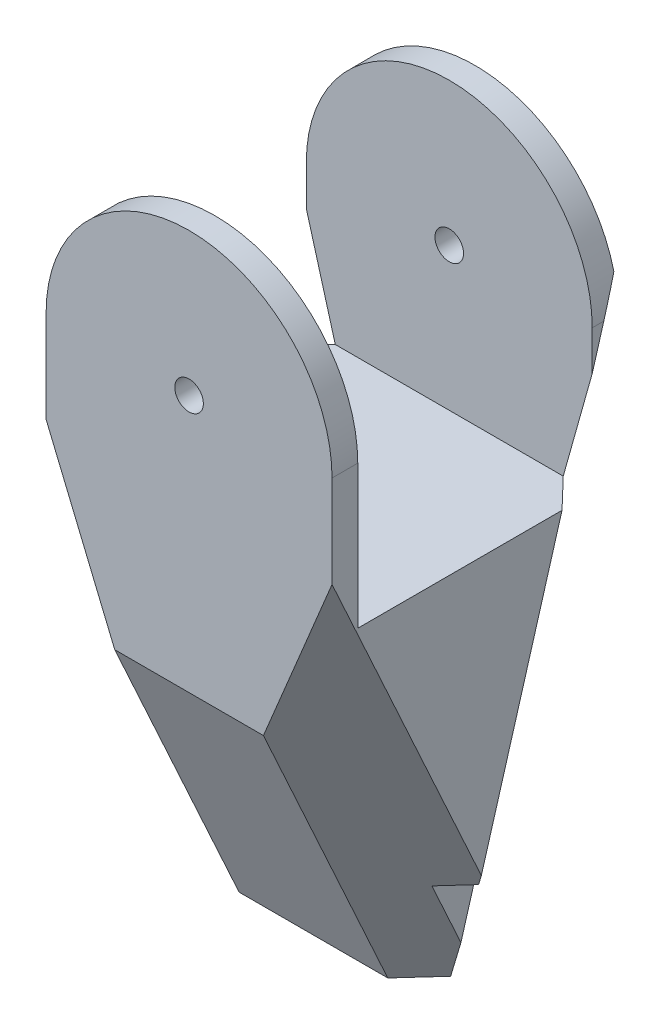
ISO-10303-21;
HEADER;
FILE_DESCRIPTION(('STEP AP214'),'2;1');
FILE_NAME('part.step','',(''),(''),'','','');
FILE_SCHEMA(('AUTOMOTIVE_DESIGN { 1 0 10303 214 1 1 1 1 }'));
ENDSEC;
DATA;
#1=APPLICATION_CONTEXT('core data for automotive mechanical design processes');
#2=APPLICATION_PROTOCOL_DEFINITION('international standard','automotive_design',2000,#1);
#3=PRODUCT_CONTEXT('',#1,'mechanical');
#4=PRODUCT('Part','Part','',(#3));
#5=PRODUCT_RELATED_PRODUCT_CATEGORY('part','',(#4));
#6=PRODUCT_DEFINITION_FORMATION('','',#4);
#7=PRODUCT_DEFINITION_CONTEXT('part definition',#1,'design');
#8=PRODUCT_DEFINITION('design','',#6,#7);
#9=PRODUCT_DEFINITION_SHAPE('','',#8);
#10=(LENGTH_UNIT() NAMED_UNIT(*) SI_UNIT(.MILLI.,.METRE.));
#11=(NAMED_UNIT(*) PLANE_ANGLE_UNIT() SI_UNIT($,.RADIAN.));
#12=(NAMED_UNIT(*) SI_UNIT($,.STERADIAN.) SOLID_ANGLE_UNIT());
#13=UNCERTAINTY_MEASURE_WITH_UNIT(LENGTH_MEASURE(1.E-05),#10,'distance_accuracy_value','');
#14=(GEOMETRIC_REPRESENTATION_CONTEXT(3) GLOBAL_UNCERTAINTY_ASSIGNED_CONTEXT((#13)) GLOBAL_UNIT_ASSIGNED_CONTEXT((#10,
#11,#12)) REPRESENTATION_CONTEXT('',''));
#15=CARTESIAN_POINT('',(0.,0.,0.));
#16=DIRECTION('',(0.,0.,1.));
#17=DIRECTION('',(1.,0.,0.));
#18=AXIS2_PLACEMENT_3D('',#15,#16,#17);
#19=CARTESIAN_POINT('',(-25.,100.,25.));
#20=DIRECTION('',(1.,0.,0.));
#21=DIRECTION('',(0.,0.,-1.));
#22=AXIS2_PLACEMENT_3D('',#19,#20,#21);
#23=PLANE('',#22);
#24=DIRECTION('',(0.,0.,-1.));
#25=VECTOR('',#24,1.);
#26=CARTESIAN_POINT('',(-25.,125.,-20.5));
#27=LINE('',#26,#25);
#28=CARTESIAN_POINT('',(-25.,125.,-20.5));
#29=VERTEX_POINT('',#28);
#30=CARTESIAN_POINT('',(-25.,125.,-22.5269685393409));
#31=VERTEX_POINT('',#30);
#32=EDGE_CURVE('E297',#29,#31,#27,.T.);
#33=ORIENTED_EDGE('',*,*,#32,.T.);
#34=DIRECTION('',(0.,-0.959829265823924,0.280584711750137));
#35=VECTOR('',#34,1.);
#36=CARTESIAN_POINT('',(-25.,89.1685441728664,-12.0524403468568));
#37=LINE('',#36,#35);
#38=CARTESIAN_POINT('',(-25.,118.066109294307,-20.5));
#39=VERTEX_POINT('',#38);
#40=EDGE_CURVE('E416',#31,#39,#37,.T.);
#41=ORIENTED_EDGE('',*,*,#40,.T.);
#42=DIRECTION('',(0.,1.,0.));
#43=VECTOR('',#42,1.);
#44=CARTESIAN_POINT('',(-25.,100.,-20.5));
#45=LINE('',#44,#43);
#46=EDGE_CURVE('E290',#39,#29,#45,.T.);
#47=ORIENTED_EDGE('',*,*,#46,.T.);
#48=EDGE_LOOP('',(#33,#41,#47));
#49=FACE_BOUND('',#48,.T.);
#50=ADVANCED_FACE('F88',(#49),#23,.F.);
#51=CARTESIAN_POINT('',(25.,100.,25.));
#52=DIRECTION('',(-1.,0.,0.));
#53=DIRECTION('',(0.,0.,1.));
#54=AXIS2_PLACEMENT_3D('',#51,#52,#53);
#55=PLANE('',#54);
#56=DIRECTION('',(0.,-0.909538676075035,-0.415619293011853));
#57=VECTOR('',#56,1.);
#58=CARTESIAN_POINT('',(25.,101.532643581669,21.6459723174444));
#59=LINE('',#58,#57);
#60=CARTESIAN_POINT('',(25.,108.872576903348,25.));
#61=VERTEX_POINT('',#60);
#62=CARTESIAN_POINT('',(25.,51.7347196548867,-1.10949535021056));
#63=VERTEX_POINT('',#62);
#64=EDGE_CURVE('E320',#61,#63,#59,.T.);
#65=ORIENTED_EDGE('',*,*,#64,.T.);
#66=DIRECTION('',(0.,0.959829265823924,-0.280584711750137));
#67=VECTOR('',#66,1.);
#68=CARTESIAN_POINT('',(25.,89.1685441728664,-12.0524403468568));
#69=LINE('',#68,#67);
#70=CARTESIAN_POINT('',(25.,100.,-15.2187752558906));
#71=VERTEX_POINT('',#70);
#72=EDGE_CURVE('E362',#63,#71,#69,.T.);
#73=ORIENTED_EDGE('',*,*,#72,.T.);
#74=DIRECTION('',(0.,0.,-1.));
#75=VECTOR('',#74,1.);
#76=CARTESIAN_POINT('',(25.,100.,25.));
#77=LINE('',#76,#75);
#78=CARTESIAN_POINT('',(25.,100.,20.5));
#79=VERTEX_POINT('',#78);
#80=EDGE_CURVE('E257',#79,#71,#77,.T.);
#81=ORIENTED_EDGE('',*,*,#80,.F.);
#82=DIRECTION('',(0.,-1.,0.));
#83=VECTOR('',#82,1.);
#84=CARTESIAN_POINT('',(25.,100.,20.5));
#85=LINE('',#84,#83);
#86=CARTESIAN_POINT('',(25.,125.,20.5));
#87=VERTEX_POINT('',#86);
#88=EDGE_CURVE('E232',#87,#79,#85,.T.);
#89=ORIENTED_EDGE('',*,*,#88,.F.);
#90=DIRECTION('',(0.,0.,1.));
#91=VECTOR('',#90,1.);
#92=CARTESIAN_POINT('',(25.,125.,20.5));
#93=LINE('',#92,#91);
#94=CARTESIAN_POINT('',(25.,125.,25.));
#95=VERTEX_POINT('',#94);
#96=EDGE_CURVE('E242',#87,#95,#93,.T.);
#97=ORIENTED_EDGE('',*,*,#96,.T.);
#98=DIRECTION('',(0.,-1.,0.));
#99=VECTOR('',#98,1.);
#100=CARTESIAN_POINT('',(25.,100.,25.));
#101=LINE('',#100,#99);
#102=EDGE_CURVE('E313',#95,#61,#101,.T.);
#103=ORIENTED_EDGE('',*,*,#102,.T.);
#104=EDGE_LOOP('',(#65,#73,#81,#89,#97,#103));
#105=FACE_BOUND('',#104,.T.);
#106=ADVANCED_FACE('F254',(#105),#55,.F.);
#107=DIRECTION('',(0.,0.,1.));
#108=VECTOR('',#107,1.);
#109=CARTESIAN_POINT('',(-25.,100.,25.));
#110=LINE('',#109,#108);
#111=CARTESIAN_POINT('',(-25.,100.,-15.2187752558907));
#112=VERTEX_POINT('',#111);
#113=CARTESIAN_POINT('',(-25.,100.,20.5));
#114=VERTEX_POINT('',#113);
#115=EDGE_CURVE('E310',#112,#114,#110,.T.);
#116=ORIENTED_EDGE('',*,*,#115,.F.);
#117=DIRECTION('',(0.,-0.959829265823924,0.280584711750137));
#118=VECTOR('',#117,1.);
#119=CARTESIAN_POINT('',(-25.,89.1685441728664,-12.0524403468568));
#120=LINE('',#119,#118);
#121=CARTESIAN_POINT('',(-25.,51.7347196548867,-1.10949535021057));
#122=VERTEX_POINT('',#121);
#123=EDGE_CURVE('E413',#112,#122,#120,.T.);
#124=ORIENTED_EDGE('',*,*,#123,.T.);
#125=DIRECTION('',(0.,0.909538676075035,0.415619293011853));
#126=VECTOR('',#125,1.);
#127=CARTESIAN_POINT('',(-25.,101.532643581669,21.6459723174444));
#128=LINE('',#127,#126);
#129=CARTESIAN_POINT('',(-25.,108.872576903348,25.));
#130=VERTEX_POINT('',#129);
#131=EDGE_CURVE('E350',#122,#130,#128,.T.);
#132=ORIENTED_EDGE('',*,*,#131,.T.);
#133=DIRECTION('',(0.,-1.,0.));
#134=VECTOR('',#133,1.);
#135=CARTESIAN_POINT('',(-25.,100.,25.));
#136=LINE('',#135,#134);
#137=CARTESIAN_POINT('',(-25.,125.,25.));
#138=VERTEX_POINT('',#137);
#139=EDGE_CURVE('E316',#138,#130,#136,.T.);
#140=ORIENTED_EDGE('',*,*,#139,.F.);
#141=DIRECTION('',(0.,0.,1.));
#142=VECTOR('',#141,1.);
#143=CARTESIAN_POINT('',(-25.,125.,20.5));
#144=LINE('',#143,#142);
#145=CARTESIAN_POINT('',(-25.,125.,20.5));
#146=VERTEX_POINT('',#145);
#147=EDGE_CURVE('E249',#146,#138,#144,.T.);
#148=ORIENTED_EDGE('',*,*,#147,.F.);
#149=DIRECTION('',(0.,1.,0.));
#150=VECTOR('',#149,1.);
#151=CARTESIAN_POINT('',(-25.,100.,20.5));
#152=LINE('',#151,#150);
#153=EDGE_CURVE('E234',#114,#146,#152,.T.);
#154=ORIENTED_EDGE('',*,*,#153,.F.);
#155=EDGE_LOOP('',(#116,#124,#132,#140,#148,#154));
#156=FACE_BOUND('',#155,.T.);
#157=ADVANCED_FACE('F499',(#156),#23,.F.);
#158=CARTESIAN_POINT('',(-25.,100.,25.));
#159=DIRECTION('',(0.,0.,-1.));
#160=DIRECTION('',(-1.,0.,0.));
#161=AXIS2_PLACEMENT_3D('',#158,#159,#160);
#162=PLANE('',#161);
#163=CARTESIAN_POINT('',(0.,125.,25.));
#164=DIRECTION('',(0.,0.,-1.));
#165=DIRECTION('',(-1.,0.,0.));
#166=AXIS2_PLACEMENT_3D('',#163,#164,#165);
#167=CIRCLE('',#166,2.5);
#168=CARTESIAN_POINT('',(-2.5,125.,25.));
#169=VERTEX_POINT('',#168);
#170=EDGE_CURVE('E264',#169,#169,#167,.T.);
#171=ORIENTED_EDGE('',*,*,#170,.T.);
#172=EDGE_LOOP('',(#171));
#173=FACE_BOUND('',#172,.T.);
#174=DIRECTION('',(1.,0.,0.));
#175=VECTOR('',#174,1.);
#176=CARTESIAN_POINT('',(-25.,80.,25.));
#177=LINE('',#176,#175);
#178=CARTESIAN_POINT('',(-13.,80.,25.));
#179=VERTEX_POINT('',#178);
#180=CARTESIAN_POINT('',(13.,80.,25.));
#181=VERTEX_POINT('',#180);
#182=EDGE_CURVE('E453',#179,#181,#177,.T.);
#183=ORIENTED_EDGE('',*,*,#182,.T.);
#184=DIRECTION('',(-0.383791137484564,-0.923419927653884,0.));
#185=VECTOR('',#184,1.);
#186=CARTESIAN_POINT('',(22.3987248092515,102.613783737377,25.));
#187=LINE('',#186,#185);
#188=EDGE_CURVE('E347',#181,#61,#187,.F.);
#189=ORIENTED_EDGE('',*,*,#188,.T.);
#190=ORIENTED_EDGE('',*,*,#102,.F.);
#191=CARTESIAN_POINT('',(0.,125.,25.));
#192=DIRECTION('',(0.,0.,-1.));
#193=DIRECTION('',(1.,0.,0.));
#194=AXIS2_PLACEMENT_3D('',#191,#192,#193);
#195=CIRCLE('',#194,25.);
#196=EDGE_CURVE('E245',#138,#95,#195,.T.);
#197=ORIENTED_EDGE('',*,*,#196,.F.);
#198=ORIENTED_EDGE('',*,*,#139,.T.);
#199=DIRECTION('',(-0.383791137484564,0.923419927653884,0.));
#200=VECTOR('',#199,1.);
#201=CARTESIAN_POINT('',(-22.3987248092515,102.613783737377,25.));
#202=LINE('',#201,#200);
#203=EDGE_CURVE('E344',#130,#179,#202,.F.);
#204=ORIENTED_EDGE('',*,*,#203,.T.);
#205=EDGE_LOOP('',(#183,#189,#190,#197,#198,#204));
#206=FACE_BOUND('',#205,.T.);
#207=ADVANCED_FACE('F478',(#173,#206),#162,.F.);
#208=CARTESIAN_POINT('',(-25.,100.,-25.));
#209=DIRECTION('',(0.,0.,1.));
#210=DIRECTION('',(1.,0.,0.));
#211=AXIS2_PLACEMENT_3D('',#208,#209,#210);
#212=PLANE('',#211);
#213=CARTESIAN_POINT('',(0.,125.,-25.));
#214=DIRECTION('',(0.,0.,-1.));
#215=DIRECTION('',(-1.,0.,0.));
#216=AXIS2_PLACEMENT_3D('',#213,#214,#215);
#217=CIRCLE('',#216,2.5);
#218=CARTESIAN_POINT('',(-2.5,125.,-25.));
#219=VERTEX_POINT('',#218);
#220=EDGE_CURVE('E272',#219,#219,#217,.T.);
#221=ORIENTED_EDGE('',*,*,#220,.F.);
#222=EDGE_LOOP('',(#221));
#223=FACE_BOUND('',#222,.T.);
#224=CARTESIAN_POINT('',(0.,125.,-25.));
#225=DIRECTION('',(0.,0.,-1.));
#226=DIRECTION('',(1.,0.,0.));
#227=AXIS2_PLACEMENT_3D('',#224,#225,#226);
#228=CIRCLE('',#227,25.);
#229=CARTESIAN_POINT('',(-24.2882226521992,130.923026287059,-25.));
#230=VERTEX_POINT('',#229);
#231=CARTESIAN_POINT('',(24.2882226521992,130.92302628706,-25.));
#232=VERTEX_POINT('',#231);
#233=EDGE_CURVE('E278',#230,#232,#228,.T.);
#234=ORIENTED_EDGE('',*,*,#233,.T.);
#235=DIRECTION('',(0.270151928578531,0.962817706258719,0.));
#236=VECTOR('',#235,1.);
#237=CARTESIAN_POINT('',(13.4795340389793,92.4010107937666,-25.));
#238=LINE('',#237,#236);
#239=CARTESIAN_POINT('',(9.99999999999994,80.,-25.));
#240=VERTEX_POINT('',#239);
#241=EDGE_CURVE('E386',#232,#240,#238,.F.);
#242=ORIENTED_EDGE('',*,*,#241,.T.);
#243=DIRECTION('',(1.,0.,0.));
#244=VECTOR('',#243,1.);
#245=CARTESIAN_POINT('',(-25.,80.,-25.));
#246=LINE('',#245,#244);
#247=CARTESIAN_POINT('',(-9.99999999999996,80.,-25.));
#248=VERTEX_POINT('',#247);
#249=EDGE_CURVE('E460',#248,#240,#246,.T.);
#250=ORIENTED_EDGE('',*,*,#249,.F.);
#251=DIRECTION('',(0.270151928578531,-0.962817706258719,0.));
#252=VECTOR('',#251,1.);
#253=CARTESIAN_POINT('',(-13.4795340389793,92.4010107937666,-25.));
#254=LINE('',#253,#252);
#255=EDGE_CURVE('E383',#248,#230,#254,.F.);
#256=ORIENTED_EDGE('',*,*,#255,.T.);
#257=EDGE_LOOP('',(#234,#242,#250,#256));
#258=FACE_BOUND('',#257,.T.);
#259=ADVANCED_FACE('F514',(#223,#258),#212,.F.);
#260=DIRECTION('',(0.,-1.,0.));
#261=VECTOR('',#260,1.);
#262=CARTESIAN_POINT('',(25.,100.,-20.5));
#263=LINE('',#262,#261);
#264=CARTESIAN_POINT('',(25.,125.,-20.5));
#265=VERTEX_POINT('',#264);
#266=CARTESIAN_POINT('',(25.,118.066109294307,-20.5));
#267=VERTEX_POINT('',#266);
#268=EDGE_CURVE('E282',#265,#267,#263,.T.);
#269=ORIENTED_EDGE('',*,*,#268,.T.);
#270=DIRECTION('',(0.,0.959829265823924,-0.280584711750137));
#271=VECTOR('',#270,1.);
#272=CARTESIAN_POINT('',(25.,89.1685441728664,-12.0524403468568));
#273=LINE('',#272,#271);
#274=CARTESIAN_POINT('',(25.,125.,-22.5269685393409));
#275=VERTEX_POINT('',#274);
#276=EDGE_CURVE('E359',#267,#275,#273,.T.);
#277=ORIENTED_EDGE('',*,*,#276,.T.);
#278=DIRECTION('',(0.,0.,-1.));
#279=VECTOR('',#278,1.);
#280=CARTESIAN_POINT('',(25.,125.,-20.5));
#281=LINE('',#280,#279);
#282=EDGE_CURVE('E301',#265,#275,#281,.T.);
#283=ORIENTED_EDGE('',*,*,#282,.F.);
#284=EDGE_LOOP('',(#269,#277,#283));
#285=FACE_BOUND('',#284,.T.);
#286=ADVANCED_FACE('F505',(#285),#55,.F.);
#287=CARTESIAN_POINT('',(0.,100.,0.));
#288=DIRECTION('',(0.,-1.,0.));
#289=DIRECTION('',(0.,0.,-1.));
#290=AXIS2_PLACEMENT_3D('',#287,#288,#289);
#291=PLANE('',#290);
#292=ORIENTED_EDGE('',*,*,#80,.T.);
#293=DIRECTION('',(0.69246772471892,0.,0.721448854890353));
#294=VECTOR('',#293,1.);
#295=CARTESIAN_POINT('',(26.5818377428217,100.,-13.5707345062019));
#296=LINE('',#295,#294);
#297=CARTESIAN_POINT('',(19.9309259312104,100.,-20.5));
#298=VERTEX_POINT('',#297);
#299=EDGE_CURVE('E368',#71,#298,#296,.F.);
#300=ORIENTED_EDGE('',*,*,#299,.T.);
#301=DIRECTION('',(-1.,0.,0.));
#302=VECTOR('',#301,1.);
#303=CARTESIAN_POINT('',(25.,100.,-20.5));
#304=LINE('',#303,#302);
#305=CARTESIAN_POINT('',(-19.9309259312104,100.,-20.5));
#306=VERTEX_POINT('',#305);
#307=EDGE_CURVE('E286',#298,#306,#304,.T.);
#308=ORIENTED_EDGE('',*,*,#307,.T.);
#309=DIRECTION('',(0.69246772471892,0.,-0.721448854890353));
#310=VECTOR('',#309,1.);
#311=CARTESIAN_POINT('',(-26.5818377428217,100.,-13.5707345062019));
#312=LINE('',#311,#310);
#313=EDGE_CURVE('E365',#306,#112,#312,.F.);
#314=ORIENTED_EDGE('',*,*,#313,.T.);
#315=ORIENTED_EDGE('',*,*,#115,.T.);
#316=DIRECTION('',(-1.,0.,0.));
#317=VECTOR('',#316,1.);
#318=CARTESIAN_POINT('',(25.,100.,20.5));
#319=LINE('',#318,#317);
#320=EDGE_CURVE('E250',#79,#114,#319,.T.);
#321=ORIENTED_EDGE('',*,*,#320,.F.);
#322=EDGE_LOOP('',(#292,#300,#308,#314,#315,#321));
#323=FACE_BOUND('',#322,.T.);
#324=ADVANCED_FACE('F519',(#323),#291,.F.);
#325=CARTESIAN_POINT('',(0.,125.,-20.5));
#326=DIRECTION('',(0.,0.,-1.));
#327=DIRECTION('',(-1.,0.,0.));
#328=AXIS2_PLACEMENT_3D('',#325,#326,#327);
#329=CYLINDRICAL_SURFACE('',#328,25.);
#330=ORIENTED_EDGE('',*,*,#282,.T.);
#331=CARTESIAN_POINT('',(0.,125.,-48.5732674907901));
#332=DIRECTION('',(-0.707106781186547,0.198403352375795,0.678701782645403));
#333=DIRECTION('',(-0.65346609360035,0.183352595511343,-0.734413977422783));
#334=AXIS2_PLACEMENT_3D('',#331,#332,#333);
#335=ELLIPSE('',#334,36.8350292267636,25.);
#336=EDGE_CURVE('E380',#275,#232,#335,.T.);
#337=ORIENTED_EDGE('',*,*,#336,.T.);
#338=ORIENTED_EDGE('',*,*,#233,.F.);
#339=CARTESIAN_POINT('',(0.,125.,-48.5732674907902));
#340=DIRECTION('',(0.707106781186547,0.198403352375795,0.678701782645402));
#341=DIRECTION('',(0.65346609360035,0.183352595511342,-0.734413977422783));
#342=AXIS2_PLACEMENT_3D('',#339,#340,#341);
#343=ELLIPSE('',#342,36.8350292267637,25.);
#344=EDGE_CURVE('E377',#230,#31,#343,.T.);
#345=ORIENTED_EDGE('',*,*,#344,.T.);
#346=ORIENTED_EDGE('',*,*,#32,.F.);
#347=CARTESIAN_POINT('',(0.,125.,-20.5));
#348=DIRECTION('',(0.,0.,-1.));
#349=DIRECTION('',(1.,0.,0.));
#350=AXIS2_PLACEMENT_3D('',#347,#348,#349);
#351=CIRCLE('',#350,25.);
#352=EDGE_CURVE('E293',#29,#265,#351,.T.);
#353=ORIENTED_EDGE('',*,*,#352,.T.);
#354=EDGE_LOOP('',(#330,#337,#338,#345,#346,#353));
#355=FACE_BOUND('',#354,.T.);
#356=ADVANCED_FACE('F535',(#355),#329,.T.);
#357=CARTESIAN_POINT('',(0.,125.,-20.5));
#358=DIRECTION('',(0.,0.,1.));
#359=DIRECTION('',(1.,0.,0.));
#360=AXIS2_PLACEMENT_3D('',#357,#358,#359);
#361=PLANE('',#360);
#362=CARTESIAN_POINT('',(0.,125.,-20.5));
#363=DIRECTION('',(0.,0.,-1.));
#364=DIRECTION('',(-1.,0.,0.));
#365=AXIS2_PLACEMENT_3D('',#362,#363,#364);
#366=CIRCLE('',#365,2.5);
#367=CARTESIAN_POINT('',(-2.5,125.,-20.5));
#368=VERTEX_POINT('',#367);
#369=EDGE_CURVE('E274',#368,#368,#366,.T.);
#370=ORIENTED_EDGE('',*,*,#369,.T.);
#371=EDGE_LOOP('',(#370));
#372=FACE_BOUND('',#371,.T.);
#373=ORIENTED_EDGE('',*,*,#307,.F.);
#374=DIRECTION('',(-0.270151928578531,-0.962817706258719,0.));
#375=VECTOR('',#374,1.);
#376=CARTESIAN_POINT('',(24.9790023144448,117.991273835795,-20.5));
#377=LINE('',#376,#375);
#378=EDGE_CURVE('E374',#298,#267,#377,.F.);
#379=ORIENTED_EDGE('',*,*,#378,.T.);
#380=ORIENTED_EDGE('',*,*,#268,.F.);
#381=ORIENTED_EDGE('',*,*,#352,.F.);
#382=ORIENTED_EDGE('',*,*,#46,.F.);
#383=DIRECTION('',(-0.270151928578531,0.962817706258719,0.));
#384=VECTOR('',#383,1.);
#385=CARTESIAN_POINT('',(-24.9790023144448,117.991273835795,-20.5));
#386=LINE('',#385,#384);
#387=EDGE_CURVE('E371',#39,#306,#386,.F.);
#388=ORIENTED_EDGE('',*,*,#387,.T.);
#389=EDGE_LOOP('',(#373,#379,#380,#381,#382,#388));
#390=FACE_BOUND('',#389,.T.);
#391=ADVANCED_FACE('F523',(#372,#390),#361,.T.);
#392=CARTESIAN_POINT('',(0.,125.,-20.5));
#393=DIRECTION('',(0.,0.,-1.));
#394=DIRECTION('',(-1.,0.,0.));
#395=AXIS2_PLACEMENT_3D('',#392,#393,#394);
#396=CYLINDRICAL_SURFACE('',#395,2.5);
#397=ORIENTED_EDGE('',*,*,#369,.F.);
#398=EDGE_LOOP('',(#397));
#399=FACE_BOUND('',#398,.T.);
#400=ORIENTED_EDGE('',*,*,#220,.T.);
#401=EDGE_LOOP('',(#400));
#402=FACE_BOUND('',#401,.T.);
#403=ADVANCED_FACE('F662',(#399,#402),#396,.F.);
#404=CARTESIAN_POINT('',(0.,125.,20.5));
#405=DIRECTION('',(0.,0.,-1.));
#406=DIRECTION('',(1.,0.,0.));
#407=AXIS2_PLACEMENT_3D('',#404,#405,#406);
#408=PLANE('',#407);
#409=ORIENTED_EDGE('',*,*,#88,.T.);
#410=ORIENTED_EDGE('',*,*,#320,.T.);
#411=ORIENTED_EDGE('',*,*,#153,.T.);
#412=CARTESIAN_POINT('',(0.,125.,20.5));
#413=DIRECTION('',(0.,0.,-1.));
#414=DIRECTION('',(1.,0.,0.));
#415=AXIS2_PLACEMENT_3D('',#412,#413,#414);
#416=CIRCLE('',#415,25.);
#417=EDGE_CURVE('E226',#146,#87,#416,.T.);
#418=ORIENTED_EDGE('',*,*,#417,.T.);
#419=EDGE_LOOP('',(#409,#410,#411,#418));
#420=FACE_BOUND('',#419,.T.);
#421=CARTESIAN_POINT('',(0.,125.,20.5));
#422=DIRECTION('',(0.,0.,-1.));
#423=DIRECTION('',(-1.,0.,0.));
#424=AXIS2_PLACEMENT_3D('',#421,#422,#423);
#425=CIRCLE('',#424,2.5);
#426=CARTESIAN_POINT('',(-2.5,125.,20.5));
#427=VERTEX_POINT('',#426);
#428=EDGE_CURVE('E261',#427,#427,#425,.T.);
#429=ORIENTED_EDGE('',*,*,#428,.F.);
#430=EDGE_LOOP('',(#429));
#431=FACE_BOUND('',#430,.T.);
#432=ADVANCED_FACE('F228',(#420,#431),#408,.T.);
#433=CARTESIAN_POINT('',(0.,125.,20.5));
#434=DIRECTION('',(0.,0.,1.));
#435=DIRECTION('',(1.,0.,0.));
#436=AXIS2_PLACEMENT_3D('',#433,#434,#435);
#437=CYLINDRICAL_SURFACE('',#436,25.);
#438=ORIENTED_EDGE('',*,*,#196,.T.);
#439=ORIENTED_EDGE('',*,*,#96,.F.);
#440=ORIENTED_EDGE('',*,*,#417,.F.);
#441=ORIENTED_EDGE('',*,*,#147,.T.);
#442=EDGE_LOOP('',(#438,#439,#440,#441));
#443=FACE_BOUND('',#442,.T.);
#444=ADVANCED_FACE('F243',(#443),#437,.T.);
#445=CARTESIAN_POINT('',(0.,125.,20.5));
#446=DIRECTION('',(0.,0.,1.));
#447=DIRECTION('',(1.,0.,0.));
#448=AXIS2_PLACEMENT_3D('',#445,#446,#447);
#449=CYLINDRICAL_SURFACE('',#448,2.5);
#450=ORIENTED_EDGE('',*,*,#428,.T.);
#451=EDGE_LOOP('',(#450));
#452=FACE_BOUND('',#451,.T.);
#453=ORIENTED_EDGE('',*,*,#170,.F.);
#454=EDGE_LOOP('',(#453));
#455=FACE_BOUND('',#454,.T.);
#456=ADVANCED_FACE('F481',(#452,#455),#449,.F.);
#457=CARTESIAN_POINT('',(20.5,0.,0.));
#458=DIRECTION('',(-1.,0.,0.));
#459=DIRECTION('',(0.,0.,1.));
#460=AXIS2_PLACEMENT_3D('',#457,#458,#459);
#461=PLANE('',#460);
#462=DIRECTION('',(0.,0.909538676075035,0.415619293011852));
#463=VECTOR('',#462,1.);
#464=CARTESIAN_POINT('',(20.5,99.6623567631155,25.7388963597821));
#465=LINE('',#464,#463);
#466=CARTESIAN_POINT('',(20.5,50.,3.04537694149886));
#467=VERTEX_POINT('',#466);
#468=CARTESIAN_POINT('',(20.5,38.8745779359882,-2.03845310810049));
#469=VERTEX_POINT('',#468);
#470=EDGE_CURVE('E327',#467,#469,#465,.F.);
#471=ORIENTED_EDGE('',*,*,#470,.T.);
#472=DIRECTION('',(0.,-0.959829265823924,0.280584711750137));
#473=VECTOR('',#472,1.);
#474=CARTESIAN_POINT('',(20.5,87.9059129699908,-16.3716720430644));
#475=LINE('',#474,#473);
#476=CARTESIAN_POINT('',(20.5,50.,-5.29072250025093));
#477=VERTEX_POINT('',#476);
#478=EDGE_CURVE('E407',#469,#477,#475,.F.);
#479=ORIENTED_EDGE('',*,*,#478,.T.);
#480=DIRECTION('',(0.,0.,1.));
#481=VECTOR('',#480,1.);
#482=CARTESIAN_POINT('',(20.5,50.,25.));
#483=LINE('',#482,#481);
#484=EDGE_CURVE('E468',#477,#467,#483,.T.);
#485=ORIENTED_EDGE('',*,*,#484,.T.);
#486=EDGE_LOOP('',(#471,#479,#485));
#487=FACE_BOUND('',#486,.T.);
#488=ADVANCED_FACE('F483',(#487),#461,.F.);
#489=CARTESIAN_POINT('',(20.5,50.,25.));
#490=DIRECTION('',(0.,1.,0.));
#491=DIRECTION('',(0.,0.,1.));
#492=AXIS2_PLACEMENT_3D('',#489,#490,#491);
#493=PLANE('',#492);
#494=ORIENTED_EDGE('',*,*,#484,.F.);
#495=DIRECTION('',(-0.69246772471892,0.,-0.721448854890353));
#496=VECTOR('',#495,1.);
#497=CARTESIAN_POINT('',(19.2797826540724,50.,-6.56200833136185));
#498=LINE('',#497,#496);
#499=CARTESIAN_POINT('',(24.392989702787,50.,-1.23480355570279));
#500=VERTEX_POINT('',#499);
#501=EDGE_CURVE('E410',#477,#500,#498,.F.);
#502=ORIENTED_EDGE('',*,*,#501,.T.);
#503=DIRECTION('',(0.672854135215655,0.,-0.739775177147215));
#504=VECTOR('',#503,1.);
#505=CARTESIAN_POINT('',(13.2786500983812,50.,10.9849512461138));
#506=LINE('',#505,#504);
#507=EDGE_CURVE('E323',#500,#467,#506,.F.);
#508=ORIENTED_EDGE('',*,*,#507,.T.);
#509=EDGE_LOOP('',(#494,#502,#508));
#510=FACE_BOUND('',#509,.T.);
#511=ADVANCED_FACE('F490',(#510),#493,.F.);
#512=CARTESIAN_POINT('',(-20.5,0.,0.));
#513=DIRECTION('',(1.,0.,0.));
#514=DIRECTION('',(0.,0.,1.));
#515=AXIS2_PLACEMENT_3D('',#512,#513,#514);
#516=PLANE('',#515);
#517=DIRECTION('',(0.,0.,1.));
#518=VECTOR('',#517,1.);
#519=CARTESIAN_POINT('',(-20.5,50.,25.));
#520=LINE('',#519,#518);
#521=CARTESIAN_POINT('',(-20.5,50.,-5.29072250025096));
#522=VERTEX_POINT('',#521);
#523=CARTESIAN_POINT('',(-20.5,50.,3.04537694149886));
#524=VERTEX_POINT('',#523);
#525=EDGE_CURVE('E435',#522,#524,#520,.T.);
#526=ORIENTED_EDGE('',*,*,#525,.F.);
#527=DIRECTION('',(0.,0.959829265823924,-0.280584711750137));
#528=VECTOR('',#527,1.);
#529=CARTESIAN_POINT('',(-20.5,87.9059129699907,-16.3716720430644));
#530=LINE('',#529,#528);
#531=CARTESIAN_POINT('',(-20.5,38.8745779359881,-2.0384531081005));
#532=VERTEX_POINT('',#531);
#533=EDGE_CURVE('E12',#522,#532,#530,.F.);
#534=ORIENTED_EDGE('',*,*,#533,.T.);
#535=DIRECTION('',(0.,-0.909538676075035,-0.415619293011852));
#536=VECTOR('',#535,1.);
#537=CARTESIAN_POINT('',(-20.5,99.6623567631155,25.7388963597821));
#538=LINE('',#537,#536);
#539=EDGE_CURVE('E353',#532,#524,#538,.F.);
#540=ORIENTED_EDGE('',*,*,#539,.T.);
#541=EDGE_LOOP('',(#526,#534,#540));
#542=FACE_BOUND('',#541,.T.);
#543=ADVANCED_FACE('F567',(#542),#516,.F.);
#544=CARTESIAN_POINT('',(-20.5,50.,25.));
#545=DIRECTION('',(0.,-1.,0.));
#546=DIRECTION('',(0.,0.,-1.));
#547=AXIS2_PLACEMENT_3D('',#544,#545,#546);
#548=PLANE('',#547);
#549=DIRECTION('',(0.672854135215655,0.,0.739775177147215));
#550=VECTOR('',#549,1.);
#551=CARTESIAN_POINT('',(-9.57184954650072,50.,15.0604245045754));
#552=LINE('',#551,#550);
#553=CARTESIAN_POINT('',(-24.392989702787,50.,-1.2348035557028));
#554=VERTEX_POINT('',#553);
#555=EDGE_CURVE('E356',#524,#554,#552,.F.);
#556=ORIENTED_EDGE('',*,*,#555,.T.);
#557=DIRECTION('',(-0.69246772471892,0.,0.721448854890353));
#558=VECTOR('',#557,1.);
#559=CARTESIAN_POINT('',(-35.6326405717628,50.,10.4752487100276));
#560=LINE('',#559,#558);
#561=EDGE_CURVE('E98',#554,#522,#560,.F.);
#562=ORIENTED_EDGE('',*,*,#561,.T.);
#563=ORIENTED_EDGE('',*,*,#525,.T.);
#564=EDGE_LOOP('',(#556,#562,#563));
#565=FACE_BOUND('',#564,.T.);
#566=ADVANCED_FACE('F434',(#565),#548,.T.);
#567=CARTESIAN_POINT('',(-25.,32.4044720176355,3.25093070706954));
#568=DIRECTION('',(0.,1.,0.));
#569=DIRECTION('',(0.,0.,1.));
#570=AXIS2_PLACEMENT_3D('',#567,#568,#569);
#571=PLANE('',#570);
#572=DIRECTION('',(1.,0.,0.));
#573=VECTOR('',#572,1.);
#574=CARTESIAN_POINT('',(-25.,32.4044720176355,-11.0865072830805));
#575=LINE('',#574,#573);
#576=CARTESIAN_POINT('',(-9.99999999999996,32.4044720176355,-11.0865072830805));
#577=VERTEX_POINT('',#576);
#578=CARTESIAN_POINT('',(9.99999999999994,32.4044720176355,-11.0865072830805));
#579=VERTEX_POINT('',#578);
#580=EDGE_CURVE('E454',#577,#579,#575,.T.);
#581=ORIENTED_EDGE('',*,*,#580,.T.);
#582=DIRECTION('',(-0.69246772471892,0.,-0.721448854890353));
#583=VECTOR('',#582,1.);
#584=CARTESIAN_POINT('',(16.7101123612154,32.4044720176355,-4.09556358075927));
#585=LINE('',#584,#583);
#586=CARTESIAN_POINT('',(18.235990996911,32.4044720176355,-2.50582393640098));
#587=VERTEX_POINT('',#586);
#588=EDGE_CURVE('E398',#579,#587,#585,.F.);
#589=ORIENTED_EDGE('',*,*,#588,.T.);
#590=DIRECTION('',(0.672854135215655,0.,-0.739775177147215));
#591=VECTOR('',#590,1.);
#592=CARTESIAN_POINT('',(9.27646185709356,32.4044720176355,7.34480625172994));
#593=LINE('',#592,#591);
#594=CARTESIAN_POINT('',(13.,32.4044720176355,3.25093070706954));
#595=VERTEX_POINT('',#594);
#596=EDGE_CURVE('E335',#587,#595,#593,.F.);
#597=ORIENTED_EDGE('',*,*,#596,.T.);
#598=DIRECTION('',(1.,0.,0.));
#599=VECTOR('',#598,1.);
#600=CARTESIAN_POINT('',(-25.,32.4044720176355,3.25093070706954));
#601=LINE('',#600,#599);
#602=CARTESIAN_POINT('',(-13.,32.4044720176355,3.25093070706954));
#603=VERTEX_POINT('',#602);
#604=EDGE_CURVE('E448',#603,#595,#601,.T.);
#605=ORIENTED_EDGE('',*,*,#604,.F.);
#606=DIRECTION('',(0.672854135215655,0.,0.739775177147215));
#607=VECTOR('',#606,1.);
#608=CARTESIAN_POINT('',(-9.27646185709356,32.4044720176355,7.34480625172994));
#609=LINE('',#608,#607);
#610=CARTESIAN_POINT('',(-18.235990996911,32.4044720176355,-2.50582393640099));
#611=VERTEX_POINT('',#610);
#612=EDGE_CURVE('E331',#603,#611,#609,.F.);
#613=ORIENTED_EDGE('',*,*,#612,.T.);
#614=DIRECTION('',(-0.69246772471892,0.,0.721448854890353));
#615=VECTOR('',#614,1.);
#616=CARTESIAN_POINT('',(-16.7101123612154,32.4044720176355,-4.0955635807593));
#617=LINE('',#616,#615);
#618=EDGE_CURVE('E395',#611,#577,#617,.F.);
#619=ORIENTED_EDGE('',*,*,#618,.T.);
#620=EDGE_LOOP('',(#581,#589,#597,#605,#613,#619));
#621=FACE_BOUND('',#620,.T.);
#622=ADVANCED_FACE('F445',(#621),#571,.F.);
#623=CARTESIAN_POINT('',(-25.,80.,25.));
#624=DIRECTION('',(0.,0.415619293011852,-0.909538676075035));
#625=DIRECTION('',(0.,0.909538676075035,0.415619293011852));
#626=AXIS2_PLACEMENT_3D('',#623,#624,#625);
#627=PLANE('',#626);
#628=ORIENTED_EDGE('',*,*,#604,.T.);
#629=DIRECTION('',(0.,0.909538676075035,0.415619293011852));
#630=VECTOR('',#629,1.);
#631=CARTESIAN_POINT('',(13.,80.,25.));
#632=LINE('',#631,#630);
#633=EDGE_CURVE('E341',#595,#181,#632,.T.);
#634=ORIENTED_EDGE('',*,*,#633,.T.);
#635=ORIENTED_EDGE('',*,*,#182,.F.);
#636=DIRECTION('',(0.,-0.909538676075035,-0.415619293011852));
#637=VECTOR('',#636,1.);
#638=CARTESIAN_POINT('',(-13.,80.,25.));
#639=LINE('',#638,#637);
#640=EDGE_CURVE('E338',#179,#603,#639,.T.);
#641=ORIENTED_EDGE('',*,*,#640,.T.);
#642=EDGE_LOOP('',(#628,#634,#635,#641));
#643=FACE_BOUND('',#642,.T.);
#644=ADVANCED_FACE('F558',(#643),#627,.F.);
#645=CARTESIAN_POINT('',(-25.,32.4044720176355,-11.0865072830805));
#646=DIRECTION('',(0.,0.280584711750137,0.959829265823924));
#647=DIRECTION('',(0.,-0.959829265823924,0.280584711750137));
#648=AXIS2_PLACEMENT_3D('',#645,#646,#647);
#649=PLANE('',#648);
#650=ORIENTED_EDGE('',*,*,#249,.T.);
#651=DIRECTION('',(0.,-0.959829265823924,0.280584711750137));
#652=VECTOR('',#651,1.);
#653=CARTESIAN_POINT('',(9.99999999999994,32.4044720176355,-11.0865072830805));
#654=LINE('',#653,#652);
#655=EDGE_CURVE('E392',#240,#579,#654,.T.);
#656=ORIENTED_EDGE('',*,*,#655,.T.);
#657=ORIENTED_EDGE('',*,*,#580,.F.);
#658=DIRECTION('',(0.,0.959829265823924,-0.280584711750137));
#659=VECTOR('',#658,1.);
#660=CARTESIAN_POINT('',(-9.99999999999996,32.4044720176355,-11.0865072830805));
#661=LINE('',#660,#659);
#662=EDGE_CURVE('E389',#577,#248,#661,.T.);
#663=ORIENTED_EDGE('',*,*,#662,.T.);
#664=EDGE_LOOP('',(#650,#656,#657,#663));
#665=FACE_BOUND('',#664,.T.);
#666=ADVANCED_FACE('F545',(#665),#649,.F.);
#667=CARTESIAN_POINT('',(25.,101.532643581669,21.6459723174444));
#668=DIRECTION('',(-0.707106781186546,0.29388722048064,-0.643140965604093));
#669=DIRECTION('',(0.,-0.909538676075035,-0.415619293011852));
#670=AXIS2_PLACEMENT_3D('',#667,#668,#669);
#671=PLANE('',#670);
#672=ORIENTED_EDGE('',*,*,#596,.F.);
#673=DIRECTION('',(0.329516762030059,0.941696057435359,0.0680238116539102));
#674=VECTOR('',#673,1.);
#675=CARTESIAN_POINT('',(40.9625901336223,97.352757725792,2.18574285882186));
#676=LINE('',#675,#674);
#677=EDGE_CURVE('E404',#587,#469,#676,.T.);
#678=ORIENTED_EDGE('',*,*,#677,.T.);
#679=ORIENTED_EDGE('',*,*,#470,.F.);
#680=ORIENTED_EDGE('',*,*,#507,.F.);
#681=DIRECTION('',(0.329516762030059,0.941696057435359,0.0680238116539102));
#682=VECTOR('',#681,1.);
#683=CARTESIAN_POINT('',(40.9625901336223,97.352757725792,2.18574285882186));
#684=LINE('',#683,#682);
#685=EDGE_CURVE('E401',#500,#63,#684,.T.);
#686=ORIENTED_EDGE('',*,*,#685,.T.);
#687=ORIENTED_EDGE('',*,*,#64,.F.);
#688=ORIENTED_EDGE('',*,*,#188,.F.);
#689=ORIENTED_EDGE('',*,*,#633,.F.);
#690=EDGE_LOOP('',(#672,#678,#679,#680,#686,#687,#688,#689));
#691=FACE_BOUND('',#690,.T.);
#692=ADVANCED_FACE('F547',(#691),#671,.F.);
#693=CARTESIAN_POINT('',(-25.,101.532643581669,21.6459723174444));
#694=DIRECTION('',(0.707106781186546,0.29388722048064,-0.643140965604093));
#695=DIRECTION('',(0.,0.909538676075035,0.415619293011852));
#696=AXIS2_PLACEMENT_3D('',#693,#694,#695);
#697=PLANE('',#696);
#698=ORIENTED_EDGE('',*,*,#131,.F.);
#699=DIRECTION('',(0.329516762030059,-0.941696057435359,-0.0680238116539104));
#700=VECTOR('',#699,1.);
#701=CARTESIAN_POINT('',(-40.9625901336223,97.352757725792,2.18574285882185));
#702=LINE('',#701,#700);
#703=EDGE_CURVE('E423',#122,#554,#702,.T.);
#704=ORIENTED_EDGE('',*,*,#703,.T.);
#705=ORIENTED_EDGE('',*,*,#555,.F.);
#706=ORIENTED_EDGE('',*,*,#539,.F.);
#707=DIRECTION('',(0.329516762030059,-0.941696057435359,-0.0680238116539104));
#708=VECTOR('',#707,1.);
#709=CARTESIAN_POINT('',(-40.9625901336223,97.352757725792,2.18574285882185));
#710=LINE('',#709,#708);
#711=EDGE_CURVE('E420',#532,#611,#710,.T.);
#712=ORIENTED_EDGE('',*,*,#711,.T.);
#713=ORIENTED_EDGE('',*,*,#612,.F.);
#714=ORIENTED_EDGE('',*,*,#640,.F.);
#715=ORIENTED_EDGE('',*,*,#203,.F.);
#716=EDGE_LOOP('',(#698,#704,#705,#706,#712,#713,#714,#715));
#717=FACE_BOUND('',#716,.T.);
#718=ADVANCED_FACE('F430',(#717),#697,.F.);
#719=CARTESIAN_POINT('',(25.,89.1685441728664,-12.0524403468568));
#720=DIRECTION('',(-0.707106781186547,0.198403352375795,0.678701782645403));
#721=DIRECTION('',(0.,0.959829265823924,-0.280584711750137));
#722=AXIS2_PLACEMENT_3D('',#719,#720,#721);
#723=PLANE('',#722);
#724=ORIENTED_EDGE('',*,*,#588,.F.);
#725=ORIENTED_EDGE('',*,*,#655,.F.);
#726=ORIENTED_EDGE('',*,*,#241,.F.);
#727=ORIENTED_EDGE('',*,*,#336,.F.);
#728=ORIENTED_EDGE('',*,*,#276,.F.);
#729=ORIENTED_EDGE('',*,*,#378,.F.);
#730=ORIENTED_EDGE('',*,*,#299,.F.);
#731=ORIENTED_EDGE('',*,*,#72,.F.);
#732=ORIENTED_EDGE('',*,*,#685,.F.);
#733=ORIENTED_EDGE('',*,*,#501,.F.);
#734=ORIENTED_EDGE('',*,*,#478,.F.);
#735=ORIENTED_EDGE('',*,*,#677,.F.);
#736=EDGE_LOOP('',(#724,#725,#726,#727,#728,#729,#730,#731,#732,#733,#734,#735));
#737=FACE_BOUND('',#736,.T.);
#738=ADVANCED_FACE('F529',(#737),#723,.F.);
#739=CARTESIAN_POINT('',(-25.,89.1685441728664,-12.0524403468568));
#740=DIRECTION('',(0.707106781186547,0.198403352375795,0.678701782645402));
#741=DIRECTION('',(0.,-0.959829265823924,0.280584711750137));
#742=AXIS2_PLACEMENT_3D('',#739,#740,#741);
#743=PLANE('',#742);
#744=ORIENTED_EDGE('',*,*,#255,.F.);
#745=ORIENTED_EDGE('',*,*,#662,.F.);
#746=ORIENTED_EDGE('',*,*,#618,.F.);
#747=ORIENTED_EDGE('',*,*,#711,.F.);
#748=ORIENTED_EDGE('',*,*,#533,.F.);
#749=ORIENTED_EDGE('',*,*,#561,.F.);
#750=ORIENTED_EDGE('',*,*,#703,.F.);
#751=ORIENTED_EDGE('',*,*,#123,.F.);
#752=ORIENTED_EDGE('',*,*,#313,.F.);
#753=ORIENTED_EDGE('',*,*,#387,.F.);
#754=ORIENTED_EDGE('',*,*,#40,.F.);
#755=ORIENTED_EDGE('',*,*,#344,.F.);
#756=EDGE_LOOP('',(#744,#745,#746,#747,#748,#749,#750,#751,#752,#753,#754,#755));
#757=FACE_BOUND('',#756,.T.);
#758=ADVANCED_FACE('F91',(#757),#743,.F.);
#759=CLOSED_SHELL('',(#50,#106,#157,#207,#259,#286,#324,#356,#391,#403,#432,#444,#456,#488,#511,
#543,#566,#622,#644,#666,#692,#718,#738,#758));
#760=MANIFOLD_SOLID_BREP('B2',#759);
#761=ADVANCED_BREP_SHAPE_REPRESENTATION('',(#18,#760),#14);
#762=SHAPE_DEFINITION_REPRESENTATION(#9,#761);
ENDSEC;
END-ISO-10303-21;
